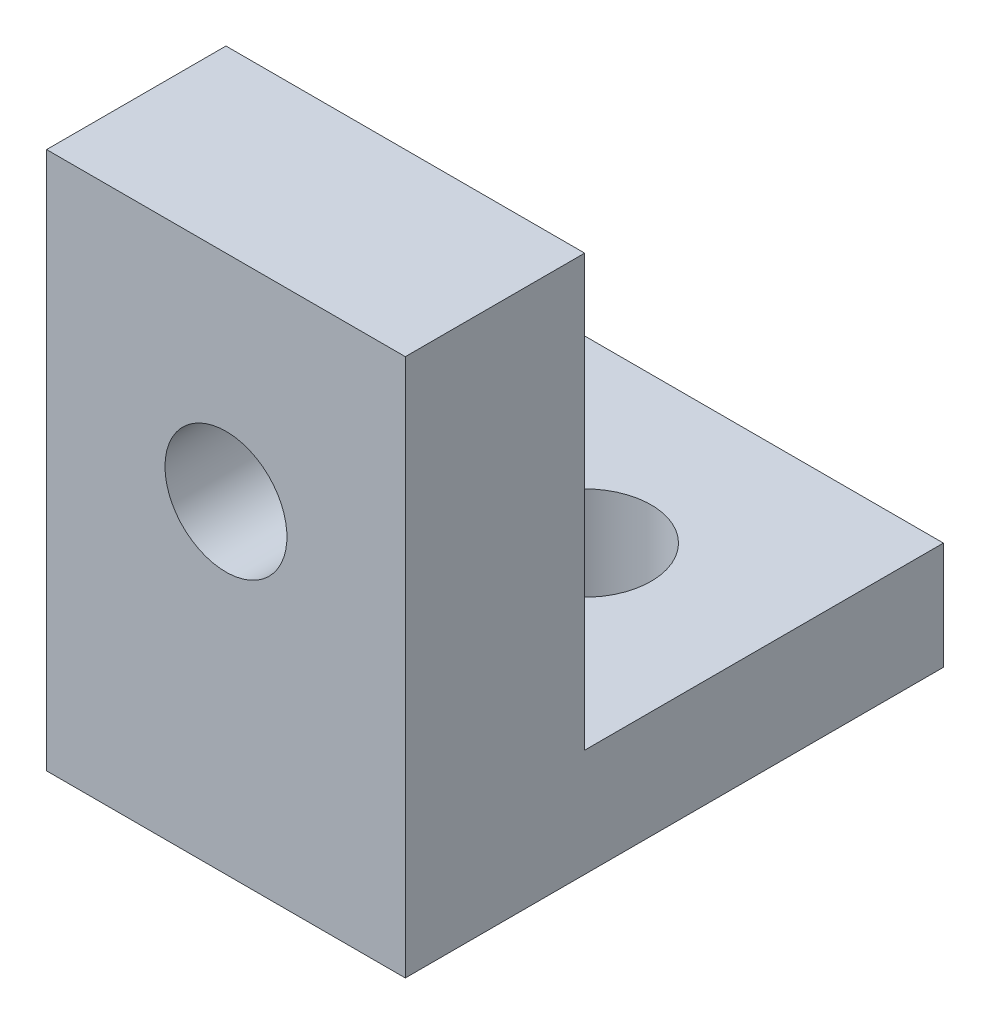
ISO-10303-21;
HEADER;
FILE_DESCRIPTION(('STEP AP214'),'2;1');
FILE_NAME('part.step','',(''),(''),'','','');
FILE_SCHEMA(('AUTOMOTIVE_DESIGN { 1 0 10303 214 1 1 1 1 }'));
ENDSEC;
DATA;
#1=APPLICATION_CONTEXT('core data for automotive mechanical design processes');
#2=APPLICATION_PROTOCOL_DEFINITION('international standard','automotive_design',2000,#1);
#3=PRODUCT_CONTEXT('',#1,'mechanical');
#4=PRODUCT('Part','Part','',(#3));
#5=PRODUCT_RELATED_PRODUCT_CATEGORY('part','',(#4));
#6=PRODUCT_DEFINITION_FORMATION('','',#4);
#7=PRODUCT_DEFINITION_CONTEXT('part definition',#1,'design');
#8=PRODUCT_DEFINITION('design','',#6,#7);
#9=PRODUCT_DEFINITION_SHAPE('','',#8);
#10=(LENGTH_UNIT() NAMED_UNIT(*) SI_UNIT(.MILLI.,.METRE.));
#11=(NAMED_UNIT(*) PLANE_ANGLE_UNIT() SI_UNIT($,.RADIAN.));
#12=(NAMED_UNIT(*) SI_UNIT($,.STERADIAN.) SOLID_ANGLE_UNIT());
#13=UNCERTAINTY_MEASURE_WITH_UNIT(LENGTH_MEASURE(1.E-05),#10,'distance_accuracy_value','');
#14=(GEOMETRIC_REPRESENTATION_CONTEXT(3) GLOBAL_UNCERTAINTY_ASSIGNED_CONTEXT((#13)) GLOBAL_UNIT_ASSIGNED_CONTEXT((#10,
#11,#12)) REPRESENTATION_CONTEXT('',''));
#15=CARTESIAN_POINT('',(0.,0.,0.));
#16=DIRECTION('',(0.,0.,1.));
#17=DIRECTION('',(1.,0.,0.));
#18=AXIS2_PLACEMENT_3D('',#15,#16,#17);
#19=CARTESIAN_POINT('',(5.,6.,5.));
#20=DIRECTION('',(0.,0.,-1.));
#21=DIRECTION('',(-1.,0.,0.));
#22=AXIS2_PLACEMENT_3D('',#19,#20,#21);
#23=CYLINDRICAL_SURFACE('',#22,1.7);
#24=CARTESIAN_POINT('',(5.,6.,5.));
#25=DIRECTION('',(0.,0.,-1.));
#26=DIRECTION('',(-1.,0.,0.));
#27=AXIS2_PLACEMENT_3D('',#24,#25,#26);
#28=CIRCLE('',#27,1.7);
#29=CARTESIAN_POINT('',(3.3,6.,5.));
#30=VERTEX_POINT('',#29);
#31=EDGE_CURVE('E164',#30,#30,#28,.T.);
#32=ORIENTED_EDGE('',*,*,#31,.F.);
#33=EDGE_LOOP('',(#32));
#34=FACE_BOUND('',#33,.T.);
#35=CARTESIAN_POINT('',(5.,6.,2.5));
#36=DIRECTION('',(0.,0.,-1.));
#37=DIRECTION('',(0.,1.,0.));
#38=AXIS2_PLACEMENT_3D('',#35,#36,#37);
#39=CIRCLE('',#38,1.7);
#40=CARTESIAN_POINT('',(5.,7.7,2.5));
#41=VERTEX_POINT('',#40);
#42=EDGE_CURVE('E37',#41,#41,#39,.F.);
#43=ORIENTED_EDGE('',*,*,#42,.F.);
#44=EDGE_LOOP('',(#43));
#45=FACE_BOUND('',#44,.T.);
#46=ADVANCED_FACE('F33',(#34,#45),#23,.F.);
#47=CARTESIAN_POINT('',(10.,-3.,5.));
#48=DIRECTION('',(0.,0.,-1.));
#49=DIRECTION('',(-1.,0.,0.));
#50=AXIS2_PLACEMENT_3D('',#47,#48,#49);
#51=PLANE('',#50);
#52=ORIENTED_EDGE('',*,*,#31,.T.);
#53=EDGE_LOOP('',(#52));
#54=FACE_BOUND('',#53,.T.);
#55=DIRECTION('',(0.,-1.,0.));
#56=VECTOR('',#55,1.);
#57=CARTESIAN_POINT('',(0.,-3.,5.));
#58=LINE('',#57,#56);
#59=CARTESIAN_POINT('',(0.,12.,5.));
#60=VERTEX_POINT('',#59);
#61=CARTESIAN_POINT('',(0.,-3.,5.));
#62=VERTEX_POINT('',#61);
#63=EDGE_CURVE('E131',#60,#62,#58,.T.);
#64=ORIENTED_EDGE('',*,*,#63,.T.);
#65=DIRECTION('',(-1.,0.,0.));
#66=VECTOR('',#65,1.);
#67=CARTESIAN_POINT('',(10.,-3.,5.));
#68=LINE('',#67,#66);
#69=CARTESIAN_POINT('',(10.,-3.,5.));
#70=VERTEX_POINT('',#69);
#71=EDGE_CURVE('E11',#70,#62,#68,.T.);
#72=ORIENTED_EDGE('',*,*,#71,.F.);
#73=DIRECTION('',(0.,-1.,0.));
#74=VECTOR('',#73,1.);
#75=CARTESIAN_POINT('',(10.,-3.,5.));
#76=LINE('',#75,#74);
#77=CARTESIAN_POINT('',(10.,12.,5.));
#78=VERTEX_POINT('',#77);
#79=EDGE_CURVE('E143',#78,#70,#76,.T.);
#80=ORIENTED_EDGE('',*,*,#79,.F.);
#81=DIRECTION('',(-1.,0.,0.));
#82=VECTOR('',#81,1.);
#83=CARTESIAN_POINT('',(10.,12.,5.));
#84=LINE('',#83,#82);
#85=EDGE_CURVE('E127',#78,#60,#84,.T.);
#86=ORIENTED_EDGE('',*,*,#85,.T.);
#87=EDGE_LOOP('',(#64,#72,#80,#86));
#88=FACE_BOUND('',#87,.T.);
#89=ADVANCED_FACE('F35',(#54,#88),#51,.F.);
#90=CARTESIAN_POINT('',(10.,-3.,-10.));
#91=DIRECTION('',(0.,1.,0.));
#92=DIRECTION('',(0.,0.,1.));
#93=AXIS2_PLACEMENT_3D('',#90,#91,#92);
#94=PLANE('',#93);
#95=CARTESIAN_POINT('',(5.,-3.,-5.));
#96=DIRECTION('',(0.,1.,0.));
#97=DIRECTION('',(0.,0.,1.));
#98=AXIS2_PLACEMENT_3D('',#95,#96,#97);
#99=CIRCLE('',#98,1.85);
#100=CARTESIAN_POINT('',(5.,-3.,-3.15));
#101=VERTEX_POINT('',#100);
#102=EDGE_CURVE('E135',#101,#101,#99,.T.);
#103=ORIENTED_EDGE('',*,*,#102,.T.);
#104=EDGE_LOOP('',(#103));
#105=FACE_BOUND('',#104,.T.);
#106=DIRECTION('',(0.,0.,-1.));
#107=VECTOR('',#106,1.);
#108=CARTESIAN_POINT('',(0.,-3.,-10.));
#109=LINE('',#108,#107);
#110=CARTESIAN_POINT('',(0.,-3.,-10.));
#111=VERTEX_POINT('',#110);
#112=EDGE_CURVE('E134',#62,#111,#109,.T.);
#113=ORIENTED_EDGE('',*,*,#112,.T.);
#114=DIRECTION('',(-1.,0.,0.));
#115=VECTOR('',#114,1.);
#116=CARTESIAN_POINT('',(10.,-3.,-10.));
#117=LINE('',#116,#115);
#118=CARTESIAN_POINT('',(10.,-3.,-10.));
#119=VERTEX_POINT('',#118);
#120=EDGE_CURVE('E42',#119,#111,#117,.T.);
#121=ORIENTED_EDGE('',*,*,#120,.F.);
#122=DIRECTION('',(0.,0.,-1.));
#123=VECTOR('',#122,1.);
#124=CARTESIAN_POINT('',(10.,-3.,-10.));
#125=LINE('',#124,#123);
#126=EDGE_CURVE('E93',#70,#119,#125,.T.);
#127=ORIENTED_EDGE('',*,*,#126,.F.);
#128=ORIENTED_EDGE('',*,*,#71,.T.);
#129=EDGE_LOOP('',(#113,#121,#127,#128));
#130=FACE_BOUND('',#129,.T.);
#131=ADVANCED_FACE('F281',(#105,#130),#94,.F.);
#132=CARTESIAN_POINT('',(10.,0.,-10.));
#133=DIRECTION('',(0.,0.,1.));
#134=DIRECTION('',(1.,0.,0.));
#135=AXIS2_PLACEMENT_3D('',#132,#133,#134);
#136=PLANE('',#135);
#137=DIRECTION('',(0.,1.,0.));
#138=VECTOR('',#137,1.);
#139=CARTESIAN_POINT('',(0.,0.,-10.));
#140=LINE('',#139,#138);
#141=CARTESIAN_POINT('',(0.,0.,-10.));
#142=VERTEX_POINT('',#141);
#143=EDGE_CURVE('E137',#111,#142,#140,.T.);
#144=ORIENTED_EDGE('',*,*,#143,.T.);
#145=DIRECTION('',(-1.,0.,0.));
#146=VECTOR('',#145,1.);
#147=CARTESIAN_POINT('',(10.,0.,-10.));
#148=LINE('',#147,#146);
#149=CARTESIAN_POINT('',(10.,0.,-10.));
#150=VERTEX_POINT('',#149);
#151=EDGE_CURVE('E122',#150,#142,#148,.T.);
#152=ORIENTED_EDGE('',*,*,#151,.F.);
#153=DIRECTION('',(0.,1.,0.));
#154=VECTOR('',#153,1.);
#155=CARTESIAN_POINT('',(10.,0.,-10.));
#156=LINE('',#155,#154);
#157=EDGE_CURVE('E110',#119,#150,#156,.T.);
#158=ORIENTED_EDGE('',*,*,#157,.F.);
#159=ORIENTED_EDGE('',*,*,#120,.T.);
#160=EDGE_LOOP('',(#144,#152,#158,#159));
#161=FACE_BOUND('',#160,.T.);
#162=ADVANCED_FACE('F150',(#161),#136,.F.);
#163=CARTESIAN_POINT('',(10.,0.,0.));
#164=DIRECTION('',(0.,-1.,0.));
#165=DIRECTION('',(0.,0.,-1.));
#166=AXIS2_PLACEMENT_3D('',#163,#164,#165);
#167=PLANE('',#166);
#168=CARTESIAN_POINT('',(5.,0.,-5.));
#169=DIRECTION('',(0.,1.,0.));
#170=DIRECTION('',(0.,0.,1.));
#171=AXIS2_PLACEMENT_3D('',#168,#169,#170);
#172=CIRCLE('',#171,1.85);
#173=CARTESIAN_POINT('',(5.,0.,-3.15));
#174=VERTEX_POINT('',#173);
#175=EDGE_CURVE('E161',#174,#174,#172,.T.);
#176=ORIENTED_EDGE('',*,*,#175,.F.);
#177=EDGE_LOOP('',(#176));
#178=FACE_BOUND('',#177,.T.);
#179=DIRECTION('',(0.,0.,1.));
#180=VECTOR('',#179,1.);
#181=CARTESIAN_POINT('',(0.,0.,0.));
#182=LINE('',#181,#180);
#183=CARTESIAN_POINT('',(0.,0.,0.));
#184=VERTEX_POINT('',#183);
#185=EDGE_CURVE('E119',#142,#184,#182,.T.);
#186=ORIENTED_EDGE('',*,*,#185,.T.);
#187=DIRECTION('',(-1.,0.,0.));
#188=VECTOR('',#187,1.);
#189=CARTESIAN_POINT('',(10.,0.,0.));
#190=LINE('',#189,#188);
#191=CARTESIAN_POINT('',(10.,0.,0.));
#192=VERTEX_POINT('',#191);
#193=EDGE_CURVE('E116',#192,#184,#190,.T.);
#194=ORIENTED_EDGE('',*,*,#193,.F.);
#195=DIRECTION('',(0.,0.,1.));
#196=VECTOR('',#195,1.);
#197=CARTESIAN_POINT('',(10.,0.,0.));
#198=LINE('',#197,#196);
#199=EDGE_CURVE('E103',#150,#192,#198,.T.);
#200=ORIENTED_EDGE('',*,*,#199,.F.);
#201=ORIENTED_EDGE('',*,*,#151,.T.);
#202=EDGE_LOOP('',(#186,#194,#200,#201));
#203=FACE_BOUND('',#202,.T.);
#204=ADVANCED_FACE('F117',(#178,#203),#167,.F.);
#205=CARTESIAN_POINT('',(10.,12.,0.));
#206=DIRECTION('',(0.,0.,1.));
#207=DIRECTION('',(0.,-1.,0.));
#208=AXIS2_PLACEMENT_3D('',#205,#206,#207);
#209=PLANE('',#208);
#210=DIRECTION('',(-0.5,0.866025403784439,0.));
#211=VECTOR('',#210,1.);
#212=CARTESIAN_POINT('',(3.32568421935009,3.1,0.));
#213=LINE('',#212,#211);
#214=CARTESIAN_POINT('',(3.32568421935009,3.1,0.));
#215=VERTEX_POINT('',#214);
#216=CARTESIAN_POINT('',(1.65136843870017,6.,0.));
#217=VERTEX_POINT('',#216);
#218=EDGE_CURVE('E199',#215,#217,#213,.T.);
#219=ORIENTED_EDGE('',*,*,#218,.F.);
#220=DIRECTION('',(-1.,0.,0.));
#221=VECTOR('',#220,1.);
#222=CARTESIAN_POINT('',(6.67431578064992,3.1,0.));
#223=LINE('',#222,#221);
#224=CARTESIAN_POINT('',(6.67431578064992,3.1,0.));
#225=VERTEX_POINT('',#224);
#226=EDGE_CURVE('E49',#225,#215,#223,.T.);
#227=ORIENTED_EDGE('',*,*,#226,.F.);
#228=DIRECTION('',(-0.5,-0.866025403784439,0.));
#229=VECTOR('',#228,1.);
#230=CARTESIAN_POINT('',(8.34863156129983,6.,0.));
#231=LINE('',#230,#229);
#232=CARTESIAN_POINT('',(8.34863156129983,6.,0.));
#233=VERTEX_POINT('',#232);
#234=EDGE_CURVE('E186',#233,#225,#231,.T.);
#235=ORIENTED_EDGE('',*,*,#234,.F.);
#236=DIRECTION('',(0.5,-0.866025403784439,0.));
#237=VECTOR('',#236,1.);
#238=CARTESIAN_POINT('',(6.67431578064992,8.9,0.));
#239=LINE('',#238,#237);
#240=CARTESIAN_POINT('',(6.67431578064992,8.9,0.));
#241=VERTEX_POINT('',#240);
#242=EDGE_CURVE('E190',#241,#233,#239,.T.);
#243=ORIENTED_EDGE('',*,*,#242,.F.);
#244=DIRECTION('',(1.,0.,0.));
#245=VECTOR('',#244,1.);
#246=CARTESIAN_POINT('',(3.32568421935008,8.9,0.));
#247=LINE('',#246,#245);
#248=CARTESIAN_POINT('',(3.32568421935008,8.9,0.));
#249=VERTEX_POINT('',#248);
#250=EDGE_CURVE('E193',#249,#241,#247,.T.);
#251=ORIENTED_EDGE('',*,*,#250,.F.);
#252=DIRECTION('',(0.5,0.866025403784439,0.));
#253=VECTOR('',#252,1.);
#254=CARTESIAN_POINT('',(1.65136843870017,6.,0.));
#255=LINE('',#254,#253);
#256=EDGE_CURVE('E196',#217,#249,#255,.T.);
#257=ORIENTED_EDGE('',*,*,#256,.F.);
#258=EDGE_LOOP('',(#219,#227,#235,#243,#251,#257));
#259=FACE_BOUND('',#258,.T.);
#260=DIRECTION('',(0.,1.,0.));
#261=VECTOR('',#260,1.);
#262=CARTESIAN_POINT('',(0.,12.,0.));
#263=LINE('',#262,#261);
#264=CARTESIAN_POINT('',(0.,12.,0.));
#265=VERTEX_POINT('',#264);
#266=EDGE_CURVE('E140',#184,#265,#263,.T.);
#267=ORIENTED_EDGE('',*,*,#266,.T.);
#268=DIRECTION('',(-1.,0.,0.));
#269=VECTOR('',#268,1.);
#270=CARTESIAN_POINT('',(10.,12.,0.));
#271=LINE('',#270,#269);
#272=CARTESIAN_POINT('',(10.,12.,0.));
#273=VERTEX_POINT('',#272);
#274=EDGE_CURVE('E123',#273,#265,#271,.T.);
#275=ORIENTED_EDGE('',*,*,#274,.F.);
#276=DIRECTION('',(0.,1.,0.));
#277=VECTOR('',#276,1.);
#278=CARTESIAN_POINT('',(10.,12.,0.));
#279=LINE('',#278,#277);
#280=EDGE_CURVE('E107',#192,#273,#279,.T.);
#281=ORIENTED_EDGE('',*,*,#280,.F.);
#282=ORIENTED_EDGE('',*,*,#193,.T.);
#283=EDGE_LOOP('',(#267,#275,#281,#282));
#284=FACE_BOUND('',#283,.T.);
#285=ADVANCED_FACE('F125',(#259,#284),#209,.F.);
#286=CARTESIAN_POINT('',(10.,12.,5.));
#287=DIRECTION('',(0.,-1.,0.));
#288=DIRECTION('',(0.,0.,-1.));
#289=AXIS2_PLACEMENT_3D('',#286,#287,#288);
#290=PLANE('',#289);
#291=DIRECTION('',(0.,0.,1.));
#292=VECTOR('',#291,1.);
#293=CARTESIAN_POINT('',(0.,12.,5.));
#294=LINE('',#293,#292);
#295=EDGE_CURVE('E85',#265,#60,#294,.T.);
#296=ORIENTED_EDGE('',*,*,#295,.T.);
#297=ORIENTED_EDGE('',*,*,#85,.F.);
#298=DIRECTION('',(0.,0.,1.));
#299=VECTOR('',#298,1.);
#300=CARTESIAN_POINT('',(10.,12.,5.));
#301=LINE('',#300,#299);
#302=EDGE_CURVE('E58',#273,#78,#301,.T.);
#303=ORIENTED_EDGE('',*,*,#302,.F.);
#304=ORIENTED_EDGE('',*,*,#274,.T.);
#305=EDGE_LOOP('',(#296,#297,#303,#304));
#306=FACE_BOUND('',#305,.T.);
#307=ADVANCED_FACE('F154',(#306),#290,.F.);
#308=CARTESIAN_POINT('',(10.,0.,0.));
#309=DIRECTION('',(-1.,0.,0.));
#310=DIRECTION('',(0.,0.,1.));
#311=AXIS2_PLACEMENT_3D('',#308,#309,#310);
#312=PLANE('',#311);
#313=ORIENTED_EDGE('',*,*,#79,.T.);
#314=ORIENTED_EDGE('',*,*,#126,.T.);
#315=ORIENTED_EDGE('',*,*,#157,.T.);
#316=ORIENTED_EDGE('',*,*,#199,.T.);
#317=ORIENTED_EDGE('',*,*,#280,.T.);
#318=ORIENTED_EDGE('',*,*,#302,.T.);
#319=EDGE_LOOP('',(#313,#314,#315,#316,#317,#318));
#320=FACE_BOUND('',#319,.T.);
#321=ADVANCED_FACE('F105',(#320),#312,.F.);
#322=CARTESIAN_POINT('',(0.,0.,0.));
#323=DIRECTION('',(-1.,0.,0.));
#324=DIRECTION('',(0.,0.,1.));
#325=AXIS2_PLACEMENT_3D('',#322,#323,#324);
#326=PLANE('',#325);
#327=ORIENTED_EDGE('',*,*,#63,.F.);
#328=ORIENTED_EDGE('',*,*,#295,.F.);
#329=ORIENTED_EDGE('',*,*,#266,.F.);
#330=ORIENTED_EDGE('',*,*,#185,.F.);
#331=ORIENTED_EDGE('',*,*,#143,.F.);
#332=ORIENTED_EDGE('',*,*,#112,.F.);
#333=EDGE_LOOP('',(#327,#328,#329,#330,#331,#332));
#334=FACE_BOUND('',#333,.T.);
#335=ADVANCED_FACE('F153',(#334),#326,.T.);
#336=CARTESIAN_POINT('',(5.,-3.,-5.));
#337=DIRECTION('',(0.,1.,0.));
#338=DIRECTION('',(0.,0.,1.));
#339=AXIS2_PLACEMENT_3D('',#336,#337,#338);
#340=CYLINDRICAL_SURFACE('',#339,1.85);
#341=ORIENTED_EDGE('',*,*,#102,.F.);
#342=EDGE_LOOP('',(#341));
#343=FACE_BOUND('',#342,.T.);
#344=ORIENTED_EDGE('',*,*,#175,.T.);
#345=EDGE_LOOP('',(#344));
#346=FACE_BOUND('',#345,.T.);
#347=ADVANCED_FACE('F288',(#343,#346),#340,.F.);
#348=CARTESIAN_POINT('',(0.,0.,2.5));
#349=DIRECTION('',(0.,0.,-1.));
#350=DIRECTION('',(0.,1.,0.));
#351=AXIS2_PLACEMENT_3D('',#348,#349,#350);
#352=PLANE('',#351);
#353=DIRECTION('',(-1.,0.,0.));
#354=VECTOR('',#353,1.);
#355=CARTESIAN_POINT('',(6.67431578064992,3.1,2.5));
#356=LINE('',#355,#354);
#357=CARTESIAN_POINT('',(6.67431578064992,3.1,2.5));
#358=VERTEX_POINT('',#357);
#359=CARTESIAN_POINT('',(3.32568421935009,3.1,2.5));
#360=VERTEX_POINT('',#359);
#361=EDGE_CURVE('E189',#358,#360,#356,.T.);
#362=ORIENTED_EDGE('',*,*,#361,.T.);
#363=DIRECTION('',(-0.5,0.866025403784439,0.));
#364=VECTOR('',#363,1.);
#365=CARTESIAN_POINT('',(3.32568421935009,3.1,2.5));
#366=LINE('',#365,#364);
#367=CARTESIAN_POINT('',(1.65136843870017,6.,2.5));
#368=VERTEX_POINT('',#367);
#369=EDGE_CURVE('E214',#360,#368,#366,.T.);
#370=ORIENTED_EDGE('',*,*,#369,.T.);
#371=DIRECTION('',(0.5,0.866025403784439,0.));
#372=VECTOR('',#371,1.);
#373=CARTESIAN_POINT('',(1.65136843870017,6.,2.5));
#374=LINE('',#373,#372);
#375=CARTESIAN_POINT('',(3.32568421935008,8.9,2.5));
#376=VERTEX_POINT('',#375);
#377=EDGE_CURVE('E211',#368,#376,#374,.T.);
#378=ORIENTED_EDGE('',*,*,#377,.T.);
#379=DIRECTION('',(1.,0.,0.));
#380=VECTOR('',#379,1.);
#381=CARTESIAN_POINT('',(3.32568421935008,8.9,2.5));
#382=LINE('',#381,#380);
#383=CARTESIAN_POINT('',(6.67431578064992,8.9,2.5));
#384=VERTEX_POINT('',#383);
#385=EDGE_CURVE('E208',#376,#384,#382,.T.);
#386=ORIENTED_EDGE('',*,*,#385,.T.);
#387=DIRECTION('',(0.5,-0.866025403784439,0.));
#388=VECTOR('',#387,1.);
#389=CARTESIAN_POINT('',(6.67431578064992,8.9,2.5));
#390=LINE('',#389,#388);
#391=CARTESIAN_POINT('',(8.34863156129983,6.,2.5));
#392=VERTEX_POINT('',#391);
#393=EDGE_CURVE('E205',#384,#392,#390,.T.);
#394=ORIENTED_EDGE('',*,*,#393,.T.);
#395=DIRECTION('',(-0.5,-0.866025403784439,0.));
#396=VECTOR('',#395,1.);
#397=CARTESIAN_POINT('',(8.34863156129983,6.,2.5));
#398=LINE('',#397,#396);
#399=EDGE_CURVE('E172',#392,#358,#398,.T.);
#400=ORIENTED_EDGE('',*,*,#399,.T.);
#401=EDGE_LOOP('',(#362,#370,#378,#386,#394,#400));
#402=FACE_BOUND('',#401,.T.);
#403=ORIENTED_EDGE('',*,*,#42,.T.);
#404=EDGE_LOOP('',(#403));
#405=FACE_BOUND('',#404,.T.);
#406=ADVANCED_FACE('F221',(#402,#405),#352,.T.);
#407=CARTESIAN_POINT('',(6.67431578064992,3.1,2.5));
#408=DIRECTION('',(0.,-1.,0.));
#409=DIRECTION('',(0.,0.,-1.));
#410=AXIS2_PLACEMENT_3D('',#407,#408,#409);
#411=PLANE('',#410);
#412=ORIENTED_EDGE('',*,*,#226,.T.);
#413=DIRECTION('',(0.,0.,-1.));
#414=VECTOR('',#413,1.);
#415=CARTESIAN_POINT('',(3.32568421935009,3.1,2.5));
#416=LINE('',#415,#414);
#417=EDGE_CURVE('E169',#360,#215,#416,.T.);
#418=ORIENTED_EDGE('',*,*,#417,.F.);
#419=ORIENTED_EDGE('',*,*,#361,.F.);
#420=DIRECTION('',(0.,0.,-1.));
#421=VECTOR('',#420,1.);
#422=CARTESIAN_POINT('',(6.67431578064992,3.1,2.5));
#423=LINE('',#422,#421);
#424=EDGE_CURVE('E184',#358,#225,#423,.T.);
#425=ORIENTED_EDGE('',*,*,#424,.T.);
#426=EDGE_LOOP('',(#412,#418,#419,#425));
#427=FACE_BOUND('',#426,.T.);
#428=ADVANCED_FACE('F227',(#427),#411,.F.);
#429=CARTESIAN_POINT('',(8.34863156129983,6.,2.5));
#430=DIRECTION('',(0.866025403784439,-0.5,0.));
#431=DIRECTION('',(0.5,0.866025403784439,0.));
#432=AXIS2_PLACEMENT_3D('',#429,#430,#431);
#433=PLANE('',#432);
#434=ORIENTED_EDGE('',*,*,#234,.T.);
#435=ORIENTED_EDGE('',*,*,#424,.F.);
#436=ORIENTED_EDGE('',*,*,#399,.F.);
#437=DIRECTION('',(0.,0.,-1.));
#438=VECTOR('',#437,1.);
#439=CARTESIAN_POINT('',(8.34863156129983,6.,2.5));
#440=LINE('',#439,#438);
#441=EDGE_CURVE('E181',#392,#233,#440,.T.);
#442=ORIENTED_EDGE('',*,*,#441,.T.);
#443=EDGE_LOOP('',(#434,#435,#436,#442));
#444=FACE_BOUND('',#443,.T.);
#445=ADVANCED_FACE('F243',(#444),#433,.F.);
#446=CARTESIAN_POINT('',(6.67431578064992,8.9,2.5));
#447=DIRECTION('',(0.866025403784439,0.5,0.));
#448=DIRECTION('',(-0.5,0.866025403784439,0.));
#449=AXIS2_PLACEMENT_3D('',#446,#447,#448);
#450=PLANE('',#449);
#451=ORIENTED_EDGE('',*,*,#242,.T.);
#452=ORIENTED_EDGE('',*,*,#441,.F.);
#453=ORIENTED_EDGE('',*,*,#393,.F.);
#454=DIRECTION('',(0.,0.,-1.));
#455=VECTOR('',#454,1.);
#456=CARTESIAN_POINT('',(6.67431578064992,8.9,2.5));
#457=LINE('',#456,#455);
#458=EDGE_CURVE('E178',#384,#241,#457,.T.);
#459=ORIENTED_EDGE('',*,*,#458,.T.);
#460=EDGE_LOOP('',(#451,#452,#453,#459));
#461=FACE_BOUND('',#460,.T.);
#462=ADVANCED_FACE('F248',(#461),#450,.F.);
#463=CARTESIAN_POINT('',(3.32568421935008,8.9,2.5));
#464=DIRECTION('',(0.,1.,0.));
#465=DIRECTION('',(0.,0.,1.));
#466=AXIS2_PLACEMENT_3D('',#463,#464,#465);
#467=PLANE('',#466);
#468=ORIENTED_EDGE('',*,*,#250,.T.);
#469=ORIENTED_EDGE('',*,*,#458,.F.);
#470=ORIENTED_EDGE('',*,*,#385,.F.);
#471=DIRECTION('',(0.,0.,-1.));
#472=VECTOR('',#471,1.);
#473=CARTESIAN_POINT('',(3.32568421935008,8.9,2.5));
#474=LINE('',#473,#472);
#475=EDGE_CURVE('E175',#376,#249,#474,.T.);
#476=ORIENTED_EDGE('',*,*,#475,.T.);
#477=EDGE_LOOP('',(#468,#469,#470,#476));
#478=FACE_BOUND('',#477,.T.);
#479=ADVANCED_FACE('F266',(#478),#467,.F.);
#480=CARTESIAN_POINT('',(1.65136843870017,6.,2.5));
#481=DIRECTION('',(-0.866025403784439,0.5,0.));
#482=DIRECTION('',(-0.5,-0.866025403784439,0.));
#483=AXIS2_PLACEMENT_3D('',#480,#481,#482);
#484=PLANE('',#483);
#485=ORIENTED_EDGE('',*,*,#256,.T.);
#486=ORIENTED_EDGE('',*,*,#475,.F.);
#487=ORIENTED_EDGE('',*,*,#377,.F.);
#488=DIRECTION('',(0.,0.,-1.));
#489=VECTOR('',#488,1.);
#490=CARTESIAN_POINT('',(1.65136843870017,6.,2.5));
#491=LINE('',#490,#489);
#492=EDGE_CURVE('E171',#368,#217,#491,.T.);
#493=ORIENTED_EDGE('',*,*,#492,.T.);
#494=EDGE_LOOP('',(#485,#486,#487,#493));
#495=FACE_BOUND('',#494,.T.);
#496=ADVANCED_FACE('F262',(#495),#484,.F.);
#497=CARTESIAN_POINT('',(3.32568421935009,3.1,2.5));
#498=DIRECTION('',(-0.866025403784439,-0.5,0.));
#499=DIRECTION('',(0.5,-0.866025403784439,0.));
#500=AXIS2_PLACEMENT_3D('',#497,#498,#499);
#501=PLANE('',#500);
#502=ORIENTED_EDGE('',*,*,#218,.T.);
#503=ORIENTED_EDGE('',*,*,#492,.F.);
#504=ORIENTED_EDGE('',*,*,#369,.F.);
#505=ORIENTED_EDGE('',*,*,#417,.T.);
#506=EDGE_LOOP('',(#502,#503,#504,#505));
#507=FACE_BOUND('',#506,.T.);
#508=ADVANCED_FACE('F256',(#507),#501,.F.);
#509=CLOSED_SHELL('',(#46,#89,#131,#162,#204,#285,#307,#321,#335,#347,#406,#428,#445,#462,#479,
#496,#508));
#510=MANIFOLD_SOLID_BREP('B2',#509);
#511=ADVANCED_BREP_SHAPE_REPRESENTATION('',(#18,#510),#14);
#512=SHAPE_DEFINITION_REPRESENTATION(#9,#511);
ENDSEC;
END-ISO-10303-21;
